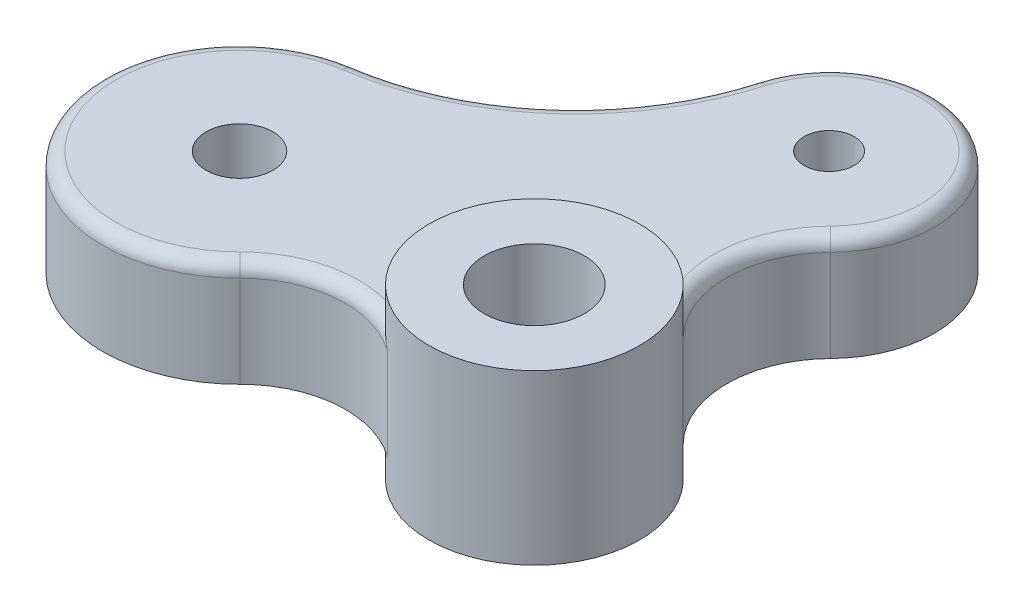
ISO-10303-21;
HEADER;
FILE_DESCRIPTION(('STEP AP214'),'2;1');
FILE_NAME('part.step','',(''),(''),'','','');
FILE_SCHEMA(('AUTOMOTIVE_DESIGN { 1 0 10303 214 1 1 1 1 }'));
ENDSEC;
DATA;
#1=APPLICATION_CONTEXT('core data for automotive mechanical design processes');
#2=APPLICATION_PROTOCOL_DEFINITION('international standard','automotive_design',2000,#1);
#3=PRODUCT_CONTEXT('',#1,'mechanical');
#4=PRODUCT('Part','Part','',(#3));
#5=PRODUCT_RELATED_PRODUCT_CATEGORY('part','',(#4));
#6=PRODUCT_DEFINITION_FORMATION('','',#4);
#7=PRODUCT_DEFINITION_CONTEXT('part definition',#1,'design');
#8=PRODUCT_DEFINITION('design','',#6,#7);
#9=PRODUCT_DEFINITION_SHAPE('','',#8);
#10=(LENGTH_UNIT() NAMED_UNIT(*) SI_UNIT(.MILLI.,.METRE.));
#11=(NAMED_UNIT(*) PLANE_ANGLE_UNIT() SI_UNIT($,.RADIAN.));
#12=(NAMED_UNIT(*) SI_UNIT($,.STERADIAN.) SOLID_ANGLE_UNIT());
#13=UNCERTAINTY_MEASURE_WITH_UNIT(LENGTH_MEASURE(1.E-05),#10,'distance_accuracy_value','');
#14=(GEOMETRIC_REPRESENTATION_CONTEXT(3) GLOBAL_UNCERTAINTY_ASSIGNED_CONTEXT((#13)) GLOBAL_UNIT_ASSIGNED_CONTEXT((#10,
#11,#12)) REPRESENTATION_CONTEXT('',''));
#15=CARTESIAN_POINT('',(0.,0.,0.));
#16=DIRECTION('',(0.,0.,1.));
#17=DIRECTION('',(1.,0.,0.));
#18=AXIS2_PLACEMENT_3D('',#15,#16,#17);
#19=CARTESIAN_POINT('',(0.,20.0025,0.));
#20=DIRECTION('',(0.,-1.,0.));
#21=DIRECTION('',(0.,0.,-1.));
#22=AXIS2_PLACEMENT_3D('',#19,#20,#21);
#23=CYLINDRICAL_SURFACE('',#22,11.9126);
#24=CARTESIAN_POINT('',(0.,20.0025,0.));
#25=DIRECTION('',(0.,1.,0.));
#26=DIRECTION('',(0.,0.,1.));
#27=AXIS2_PLACEMENT_3D('',#24,#25,#26);
#28=CIRCLE('',#27,11.9126);
#29=CARTESIAN_POINT('',(0.,20.0025,11.9126));
#30=VERTEX_POINT('',#29);
#31=EDGE_CURVE('E163',#30,#30,#28,.T.);
#32=ORIENTED_EDGE('',*,*,#31,.T.);
#33=EDGE_LOOP('',(#32));
#34=FACE_BOUND('',#33,.T.);
#35=CARTESIAN_POINT('',(0.,-20.0025,0.));
#36=DIRECTION('',(0.,1.,0.));
#37=DIRECTION('',(0.,0.,1.));
#38=AXIS2_PLACEMENT_3D('',#35,#36,#37);
#39=CIRCLE('',#38,11.9126);
#40=CARTESIAN_POINT('',(0.,-20.0025,11.9126));
#41=VERTEX_POINT('',#40);
#42=EDGE_CURVE('E119',#41,#41,#39,.T.);
#43=ORIENTED_EDGE('',*,*,#42,.F.);
#44=EDGE_LOOP('',(#43));
#45=FACE_BOUND('',#44,.T.);
#46=ADVANCED_FACE('F36',(#34,#45),#23,.F.);
#47=CARTESIAN_POINT('',(0.,20.0025,0.));
#48=DIRECTION('',(0.,-1.,0.));
#49=DIRECTION('',(0.,0.,-1.));
#50=AXIS2_PLACEMENT_3D('',#47,#48,#49);
#51=CYLINDRICAL_SURFACE('',#50,25.0063);
#52=DIRECTION('',(0.,-1.,0.));
#53=VECTOR('',#52,1.);
#54=CARTESIAN_POINT('',(17.8574475665249,12.4968,-17.5050451612903));
#55=LINE('',#54,#53);
#56=CARTESIAN_POINT('',(17.8574475665249,9.3218,-17.5050451612903));
#57=VERTEX_POINT('',#56);
#58=CARTESIAN_POINT('',(17.8574475665249,-12.4968,-17.5050451612903));
#59=VERTEX_POINT('',#58);
#60=EDGE_CURVE('E158',#57,#59,#55,.T.);
#61=ORIENTED_EDGE('',*,*,#60,.F.);
#62=CARTESIAN_POINT('',(10.3298286871432,12.4968,-22.7730032930282));
#63=CARTESIAN_POINT('',(10.4419521679474,12.4967936063939,-22.7221457394702));
#64=CARTESIAN_POINT('',(10.5536677196258,12.4938576603024,-22.6704713689525));
#65=CARTESIAN_POINT('',(10.7760634413224,12.4826061915554,-22.5656063497802));
#66=CARTESIAN_POINT('',(10.8867439906959,12.4742927251279,-22.5124162881159));
#67=CARTESIAN_POINT('',(11.2165241588368,12.4420508239024,-22.3509379701811));
#68=CARTESIAN_POINT('',(11.4338811455366,12.4108163941936,-22.2405060578209));
#69=CARTESIAN_POINT('',(11.8607859073873,12.332511862743,-22.0157776795195));
#70=CARTESIAN_POINT('',(12.0703892773512,12.2855996702782,-21.9015295894547));
#71=CARTESIAN_POINT('',(12.4837890668611,12.1784847584295,-21.668557450034));
#72=CARTESIAN_POINT('',(12.6875813366588,12.1182727973049,-21.5498303360996));
#73=CARTESIAN_POINT('',(13.0918595501829,11.9859041131738,-21.3066813875742));
#74=CARTESIAN_POINT('',(13.2922610073572,11.9135939627503,-21.182203562955));
#75=CARTESIAN_POINT('',(13.6869341438385,11.7595712424757,-20.9293529003005));
#76=CARTESIAN_POINT('',(13.8812044923465,11.6778566489696,-20.800979228346));
#77=CARTESIAN_POINT('',(14.263859788499,11.5066541435696,-20.5404711019414));
#78=CARTESIAN_POINT('',(14.4522414469327,11.4171619892916,-20.4083346217673));
#79=CARTESIAN_POINT('',(14.8232654961716,11.2318613357841,-20.1404613157331));
#80=CARTESIAN_POINT('',(15.0059071809191,11.1360520639599,-20.0047240507082));
#81=CARTESIAN_POINT('',(15.5473940019948,10.8400906926131,-19.5908362753573));
#82=CARTESIAN_POINT('',(15.8979370015286,10.6322664771331,-19.3072830951359));
#83=CARTESIAN_POINT('',(16.5789183048313,10.2049779479479,-18.7257818378262));
#84=CARTESIAN_POINT('',(16.9093661651873,9.98551926164557,-18.4278407260468));
#85=CARTESIAN_POINT('',(17.3348184980489,9.6921225200954,-18.0233082789914));
#86=CARTESIAN_POINT('',(17.4378603828178,9.62018255343795,-17.9236320780338));
#87=CARTESIAN_POINT('',(17.6420485271755,9.47611734834702,-17.7226882035823));
#88=CARTESIAN_POINT('',(17.7431962679432,9.40399230951588,-17.6214218981062));
#89=CARTESIAN_POINT('',(17.8481269093726,9.32850905790795,-17.5145496591785));
#90=CARTESIAN_POINT('',(17.8527881887275,9.32515452699892,-17.5097983375322));
#91=CARTESIAN_POINT('',(17.8574475665249,9.3218,-17.5050451612903));
#92=B_SPLINE_CURVE_WITH_KNOTS('',3,(#62,#63,#64,#65,#66,#67,#68,#69,#70,#71,#72,#73,#74,#75,#76,
#77,#78,#79,#80,#81,#82,#83,#84,#85,#86,#87,#88,#89,#90,#91),.UNSPECIFIED.,.F.,.F.,(4,2,2,2,2,2,
2,2,2,2,2,2,2,2,4),(0.,0.369262063996806,0.738383014913317,1.47492149695537,2.2042544435751,
2.93409579226768,3.67401295963575,4.41408964165639,5.15457257389372,5.89514623712289,
7.38352573589504,8.87119178389183,9.3523826424057,9.83318002456653,9.85554068268082),.UNSPECIFIED.);
#93=CARTESIAN_POINT('',(10.3298286871432,12.4968,-22.7730032930282));
#94=VERTEX_POINT('',#93);
#95=EDGE_CURVE('E46',#57,#94,#92,.F.);
#96=ORIENTED_EDGE('',*,*,#95,.T.);
#97=CARTESIAN_POINT('',(0.,12.4968,0.));
#98=DIRECTION('',(0.,1.,0.));
#99=DIRECTION('',(0.,0.,1.));
#100=AXIS2_PLACEMENT_3D('',#97,#98,#99);
#101=CIRCLE('',#100,25.0063);
#102=CARTESIAN_POINT('',(-20.9655076747199,12.4968,13.6294727569067));
#103=VERTEX_POINT('',#102);
#104=EDGE_CURVE('E269',#94,#103,#101,.T.);
#105=ORIENTED_EDGE('',*,*,#104,.T.);
#106=CARTESIAN_POINT('',(-20.9655076747199,12.4968,13.6294727569067));
#107=CARTESIAN_POINT('',(-20.8984042183351,12.4967936063939,13.7326972299872));
#108=CARTESIAN_POINT('',(-20.8305543900075,12.4938576603024,13.8353958465852));
#109=CARTESIAN_POINT('',(-20.6935109513742,12.4826061915555,14.0395419344793));
#110=CARTESIAN_POINT('',(-20.6243178645018,12.4742927251279,14.1409898689014));
#111=CARTESIAN_POINT('',(-20.4151913495656,12.4420508239025,14.4428115169199));
#112=CARTESIAN_POINT('',(-20.2733999686794,12.4108163941937,14.641140716084));
#113=CARTESIAN_POINT('',(-19.9871679824365,12.3325118627431,15.0294985018386));
#114=CARTESIAN_POINT('',(-19.8427668647318,12.2855996702783,15.2195893116884));
#115=CARTESIAN_POINT('',(-19.5504105265156,12.1784847584296,15.5933581911021));
#116=CARTESIAN_POINT('',(-19.4024528986838,12.118272797305,15.7770316981164));
#117=CARTESIAN_POINT('',(-19.1014034125352,11.9859041131738,16.1402554473249));
#118=CARTESIAN_POINT('',(-18.9482688731232,11.9135939627503,16.3197137591932));
#119=CARTESIAN_POINT('',(-18.6390684949176,11.7595712424756,16.6719856263391));
#120=CARTESIAN_POINT('',(-18.4830020312986,11.6778566489695,16.8447977407696));
#121=CARTESIAN_POINT('',(-18.1680338533021,11.5066541435695,17.1840389623894));
#122=CARTESIAN_POINT('',(-18.0091306295974,11.4171619892914,17.3504645136827));
#123=CARTESIAN_POINT('',(-17.6886256285269,11.2318613357839,17.6771011581185));
#124=CARTESIAN_POINT('',(-17.5270235228944,11.1360520639597,17.8373114873079));
#125=CARTESIAN_POINT('',(-17.0365826913896,10.840090692613,18.3105755349351));
#126=CARTESIAN_POINT('',(-16.7036479851339,10.6322664771332,18.6146105360554));
#127=CARTESIAN_POINT('',(-16.0265628381989,10.2049779479475,19.2006437701811));
#128=CARTESIAN_POINT('',(-15.682417850252,9.98551926164443,19.4826524965937));
#129=CARTESIAN_POINT('',(-15.2186347294205,9.6921225200957,19.8425988885613));
#130=CARTESIAN_POINT('',(-15.1046276389344,9.6201825534388,19.9295204530493));
#131=CARTESIAN_POINT('',(-14.8753243920995,9.47611734834609,20.1012506483158));
#132=CARTESIAN_POINT('',(-14.7600293660691,9.40399230951263,20.1860609487486));
#133=CARTESIAN_POINT('',(-14.638624318867,9.32850905790765,20.2737702953343));
#134=CARTESIAN_POINT('',(-14.6332274567457,9.32515452699876,20.2776659931994));
#135=CARTESIAN_POINT('',(-14.6278290463037,9.3218,20.2815595327902));
#136=B_SPLINE_CURVE_WITH_KNOTS('',3,(#106,#107,#108,#109,#110,#111,#112,#113,#114,#115,#116,
#117,#118,#119,#120,#121,#122,#123,#124,#125,#126,#127,#128,#129,#130,#131,#132,#133,#134,#135),
.UNSPECIFIED.,.F.,.F.,(4,2,2,2,2,2,2,2,2,2,2,2,2,2,4),(0.,0.369262063996613,0.738383014912932,
1.47492149695457,2.2042544435747,2.9340957922677,3.67401295963593,4.41408964165673,
5.15457257389419,5.89514623712349,7.38352573589537,8.87119178389193,9.35238264240576,
9.83318002456654,9.85554068268083),.UNSPECIFIED.);
#137=CARTESIAN_POINT('',(-14.6278290463037,9.3218,20.2815595327902));
#138=VERTEX_POINT('',#137);
#139=EDGE_CURVE('E11',#103,#138,#136,.T.);
#140=ORIENTED_EDGE('',*,*,#139,.T.);
#141=DIRECTION('',(0.,-1.,0.));
#142=VECTOR('',#141,1.);
#143=CARTESIAN_POINT('',(-14.6278290463037,12.4968,20.2815595327902));
#144=LINE('',#143,#142);
#145=CARTESIAN_POINT('',(-14.6278290463037,-12.4968,20.2815595327902));
#146=VERTEX_POINT('',#145);
#147=EDGE_CURVE('E160',#138,#146,#144,.T.);
#148=ORIENTED_EDGE('',*,*,#147,.T.);
#149=CARTESIAN_POINT('',(0.,-12.4968,0.));
#150=DIRECTION('',(0.,1.,0.));
#151=DIRECTION('',(0.,0.,1.));
#152=AXIS2_PLACEMENT_3D('',#149,#150,#151);
#153=CIRCLE('',#152,25.0063);
#154=EDGE_CURVE('E143',#59,#146,#153,.T.);
#155=ORIENTED_EDGE('',*,*,#154,.F.);
#156=EDGE_LOOP('',(#61,#96,#105,#140,#148,#155));
#157=FACE_BOUND('',#156,.T.);
#158=CARTESIAN_POINT('',(0.,20.0025,0.));
#159=DIRECTION('',(0.,1.,0.));
#160=DIRECTION('',(0.,0.,1.));
#161=AXIS2_PLACEMENT_3D('',#158,#159,#160);
#162=CIRCLE('',#161,25.0063);
#163=CARTESIAN_POINT('',(0.,20.0025,25.0063));
#164=VERTEX_POINT('',#163);
#165=EDGE_CURVE('E166',#164,#164,#162,.T.);
#166=ORIENTED_EDGE('',*,*,#165,.F.);
#167=EDGE_LOOP('',(#166));
#168=FACE_BOUND('',#167,.T.);
#169=CARTESIAN_POINT('',(0.,-20.0025,0.));
#170=DIRECTION('',(0.,1.,0.));
#171=DIRECTION('',(0.,0.,1.));
#172=AXIS2_PLACEMENT_3D('',#169,#170,#171);
#173=CIRCLE('',#172,25.0063);
#174=CARTESIAN_POINT('',(0.,-20.0025,25.0063));
#175=VERTEX_POINT('',#174);
#176=EDGE_CURVE('E167',#175,#175,#173,.T.);
#177=ORIENTED_EDGE('',*,*,#176,.T.);
#178=EDGE_LOOP('',(#177));
#179=FACE_BOUND('',#178,.T.);
#180=ADVANCED_FACE('F208',(#157,#168,#179),#51,.T.);
#181=CARTESIAN_POINT('',(0.,20.0025,0.));
#182=DIRECTION('',(0.,1.,0.));
#183=DIRECTION('',(0.,0.,1.));
#184=AXIS2_PLACEMENT_3D('',#181,#182,#183);
#185=PLANE('',#184);
#186=ORIENTED_EDGE('',*,*,#31,.F.);
#187=EDGE_LOOP('',(#186));
#188=FACE_BOUND('',#187,.T.);
#189=ORIENTED_EDGE('',*,*,#165,.T.);
#190=EDGE_LOOP('',(#189));
#191=FACE_BOUND('',#190,.T.);
#192=ADVANCED_FACE('F212',(#188,#191),#185,.T.);
#193=CARTESIAN_POINT('',(0.,-20.0025,0.));
#194=DIRECTION('',(0.,1.,0.));
#195=DIRECTION('',(0.,0.,1.));
#196=AXIS2_PLACEMENT_3D('',#193,#194,#195);
#197=PLANE('',#196);
#198=ORIENTED_EDGE('',*,*,#42,.T.);
#199=EDGE_LOOP('',(#198));
#200=FACE_BOUND('',#199,.T.);
#201=ORIENTED_EDGE('',*,*,#176,.F.);
#202=EDGE_LOOP('',(#201));
#203=FACE_BOUND('',#202,.T.);
#204=ADVANCED_FACE('F213',(#200,#203),#197,.F.);
#205=CARTESIAN_POINT('',(-84.1767783603862,12.4968,-93.9454100730132));
#206=DIRECTION('',(0.,-1.,0.));
#207=DIRECTION('',(0.,0.,-1.));
#208=AXIS2_PLACEMENT_3D('',#205,#206,#207);
#209=CYLINDRICAL_SURFACE('',#208,62.5094);
#210=DIRECTION('',(0.,-1.,0.));
#211=VECTOR('',#210,1.);
#212=CARTESIAN_POINT('',(-74.8509809683503,12.4968,-32.1355840632056));
#213=LINE('',#212,#211);
#214=CARTESIAN_POINT('',(-74.8509809683503,9.3218,-32.1355840632056));
#215=VERTEX_POINT('',#214);
#216=CARTESIAN_POINT('',(-74.8509809683503,-12.4968,-32.1355840632056));
#217=VERTEX_POINT('',#216);
#218=EDGE_CURVE('E109',#215,#217,#213,.T.);
#219=ORIENTED_EDGE('',*,*,#218,.F.);
#220=CARTESIAN_POINT('',(-84.1767783603862,9.3218,-93.9454100730132));
#221=DIRECTION('',(0.,1.,0.));
#222=DIRECTION('',(0.,0.,1.));
#223=AXIS2_PLACEMENT_3D('',#220,#221,#222);
#224=CIRCLE('',#223,62.5094);
#225=CARTESIAN_POINT('',(-24.0522531695836,9.3218,-76.8437563827838));
#226=VERTEX_POINT('',#225);
#227=EDGE_CURVE('E189',#215,#226,#224,.T.);
#228=ORIENTED_EDGE('',*,*,#227,.T.);
#229=DIRECTION('',(0.,-1.,0.));
#230=VECTOR('',#229,1.);
#231=CARTESIAN_POINT('',(-24.0522531695836,12.4968,-76.8437563827838));
#232=LINE('',#231,#230);
#233=CARTESIAN_POINT('',(-24.0522531695836,-12.4968,-76.8437563827838));
#234=VERTEX_POINT('',#233);
#235=EDGE_CURVE('E134',#226,#234,#232,.T.);
#236=ORIENTED_EDGE('',*,*,#235,.T.);
#237=CARTESIAN_POINT('',(-84.1767783603862,-12.4968,-93.9454100730132));
#238=DIRECTION('',(0.,1.,0.));
#239=DIRECTION('',(0.,0.,1.));
#240=AXIS2_PLACEMENT_3D('',#237,#238,#239);
#241=CIRCLE('',#240,62.5094);
#242=EDGE_CURVE('E127',#217,#234,#241,.T.);
#243=ORIENTED_EDGE('',*,*,#242,.F.);
#244=EDGE_LOOP('',(#219,#228,#236,#243));
#245=FACE_BOUND('',#244,.T.);
#246=ADVANCED_FACE('F132',(#245),#209,.F.);
#247=CARTESIAN_POINT('',(-70.0024,12.4968,0.));
#248=DIRECTION('',(0.,-1.,0.));
#249=DIRECTION('',(0.,0.,-1.));
#250=AXIS2_PLACEMENT_3D('',#247,#248,#249);
#251=CYLINDRICAL_SURFACE('',#250,32.4993);
#252=DIRECTION('',(0.,-1.,0.));
#253=VECTOR('',#252,1.);
#254=CARTESIAN_POINT('',(-46.9650853283781,12.4968,22.9234952223842));
#255=LINE('',#254,#253);
#256=CARTESIAN_POINT('',(-46.9650853283781,9.3218,22.9234952223842));
#257=VERTEX_POINT('',#256);
#258=CARTESIAN_POINT('',(-46.9650853283781,-12.4968,22.9234952223842));
#259=VERTEX_POINT('',#258);
#260=EDGE_CURVE('E120',#257,#259,#255,.T.);
#261=ORIENTED_EDGE('',*,*,#260,.F.);
#262=CARTESIAN_POINT('',(-70.0024,9.3218,0.));
#263=DIRECTION('',(0.,1.,0.));
#264=DIRECTION('',(0.,0.,1.));
#265=AXIS2_PLACEMENT_3D('',#262,#263,#264);
#266=CIRCLE('',#265,32.4993);
#267=EDGE_CURVE('E115',#257,#215,#266,.F.);
#268=ORIENTED_EDGE('',*,*,#267,.T.);
#269=ORIENTED_EDGE('',*,*,#218,.T.);
#270=CARTESIAN_POINT('',(-70.0024,-12.4968,0.));
#271=DIRECTION('',(0.,1.,0.));
#272=DIRECTION('',(0.,0.,1.));
#273=AXIS2_PLACEMENT_3D('',#270,#271,#272);
#274=CIRCLE('',#273,32.4993);
#275=EDGE_CURVE('E112',#217,#259,#274,.T.);
#276=ORIENTED_EDGE('',*,*,#275,.T.);
#277=EDGE_LOOP('',(#261,#268,#269,#276));
#278=FACE_BOUND('',#277,.T.);
#279=ADVANCED_FACE('F111',(#278),#251,.T.);
#280=CARTESIAN_POINT('',(-29.2482290275762,12.4968,40.5528186290478));
#281=DIRECTION('',(0.,-1.,0.));
#282=DIRECTION('',(0.,0.,-1.));
#283=AXIS2_PLACEMENT_3D('',#280,#281,#282);
#284=CYLINDRICAL_SURFACE('',#283,24.9936);
#285=ORIENTED_EDGE('',*,*,#147,.F.);
#286=CARTESIAN_POINT('',(-29.2482290275762,9.3218,40.5528186290478));
#287=DIRECTION('',(0.,1.,0.));
#288=DIRECTION('',(0.,0.,1.));
#289=AXIS2_PLACEMENT_3D('',#286,#287,#288);
#290=CIRCLE('',#289,24.9936);
#291=EDGE_CURVE('E54',#138,#257,#290,.T.);
#292=ORIENTED_EDGE('',*,*,#291,.T.);
#293=ORIENTED_EDGE('',*,*,#260,.T.);
#294=CARTESIAN_POINT('',(-29.2482290275762,-12.4968,40.5528186290478));
#295=DIRECTION('',(0.,1.,0.));
#296=DIRECTION('',(0.,0.,1.));
#297=AXIS2_PLACEMENT_3D('',#294,#295,#296);
#298=CIRCLE('',#297,24.9936);
#299=EDGE_CURVE('E130',#146,#259,#298,.T.);
#300=ORIENTED_EDGE('',*,*,#299,.F.);
#301=EDGE_LOOP('',(#285,#292,#293,#300));
#302=FACE_BOUND('',#301,.T.);
#303=ADVANCED_FACE('F246',(#302),#284,.F.);
#304=CARTESIAN_POINT('',(35.7058258351491,12.4968,-35.0012));
#305=DIRECTION('',(0.,-1.,0.));
#306=DIRECTION('',(0.,0.,-1.));
#307=AXIS2_PLACEMENT_3D('',#304,#305,#306);
#308=CYLINDRICAL_SURFACE('',#307,24.9936);
#309=DIRECTION('',(0.,-1.,0.));
#310=VECTOR('',#309,1.);
#311=CARTESIAN_POINT('',(17.8574475665249,12.4968,-52.4973548387097));
#312=LINE('',#311,#310);
#313=CARTESIAN_POINT('',(17.8574475665249,9.3218,-52.4973548387097));
#314=VERTEX_POINT('',#313);
#315=CARTESIAN_POINT('',(17.8574475665249,-12.4968,-52.4973548387097));
#316=VERTEX_POINT('',#315);
#317=EDGE_CURVE('E155',#314,#316,#312,.T.);
#318=ORIENTED_EDGE('',*,*,#317,.F.);
#319=CARTESIAN_POINT('',(35.7058258351491,9.3218,-35.0012));
#320=DIRECTION('',(0.,1.,0.));
#321=DIRECTION('',(0.,0.,1.));
#322=AXIS2_PLACEMENT_3D('',#319,#320,#321);
#323=CIRCLE('',#322,24.9936);
#324=EDGE_CURVE('E170',#314,#57,#323,.T.);
#325=ORIENTED_EDGE('',*,*,#324,.T.);
#326=ORIENTED_EDGE('',*,*,#60,.T.);
#327=CARTESIAN_POINT('',(35.7058258351491,-12.4968,-35.0012));
#328=DIRECTION('',(0.,1.,0.));
#329=DIRECTION('',(0.,0.,1.));
#330=AXIS2_PLACEMENT_3D('',#327,#328,#329);
#331=CIRCLE('',#330,24.9936);
#332=EDGE_CURVE('E145',#316,#59,#331,.T.);
#333=ORIENTED_EDGE('',*,*,#332,.F.);
#334=EDGE_LOOP('',(#318,#325,#326,#333));
#335=FACE_BOUND('',#334,.T.);
#336=ADVANCED_FACE('F249',(#335),#308,.F.);
#337=CARTESIAN_POINT('',(0.,12.4968,-70.0024));
#338=DIRECTION('',(0.,-1.,0.));
#339=DIRECTION('',(0.,0.,-1.));
#340=AXIS2_PLACEMENT_3D('',#337,#338,#339);
#341=CYLINDRICAL_SURFACE('',#340,25.0063);
#342=ORIENTED_EDGE('',*,*,#235,.F.);
#343=CARTESIAN_POINT('',(0.,9.3218,-70.0024));
#344=DIRECTION('',(0.,1.,0.));
#345=DIRECTION('',(0.,0.,1.));
#346=AXIS2_PLACEMENT_3D('',#343,#344,#345);
#347=CIRCLE('',#346,25.0063);
#348=EDGE_CURVE('E187',#226,#314,#347,.F.);
#349=ORIENTED_EDGE('',*,*,#348,.T.);
#350=ORIENTED_EDGE('',*,*,#317,.T.);
#351=CARTESIAN_POINT('',(0.,-12.4968,-70.0024));
#352=DIRECTION('',(0.,1.,0.));
#353=DIRECTION('',(0.,0.,1.));
#354=AXIS2_PLACEMENT_3D('',#351,#352,#353);
#355=CIRCLE('',#354,25.0063);
#356=EDGE_CURVE('E148',#316,#234,#355,.T.);
#357=ORIENTED_EDGE('',*,*,#356,.T.);
#358=EDGE_LOOP('',(#342,#349,#350,#357));
#359=FACE_BOUND('',#358,.T.);
#360=ADVANCED_FACE('F241',(#359),#341,.T.);
#361=CARTESIAN_POINT('',(0.,12.4968,-70.0024));
#362=DIRECTION('',(0.,-1.,0.));
#363=DIRECTION('',(0.,0.,-1.));
#364=AXIS2_PLACEMENT_3D('',#361,#362,#363);
#365=CYLINDRICAL_SURFACE('',#364,5.9563);
#366=CARTESIAN_POINT('',(0.,12.4968,-70.0024));
#367=DIRECTION('',(0.,1.,0.));
#368=DIRECTION('',(0.,0.,1.));
#369=AXIS2_PLACEMENT_3D('',#366,#367,#368);
#370=CIRCLE('',#369,5.9563);
#371=CARTESIAN_POINT('',(0.,12.4968,-64.0461));
#372=VERTEX_POINT('',#371);
#373=EDGE_CURVE('E153',#372,#372,#370,.T.);
#374=ORIENTED_EDGE('',*,*,#373,.T.);
#375=EDGE_LOOP('',(#374));
#376=FACE_BOUND('',#375,.T.);
#377=CARTESIAN_POINT('',(0.,-12.4968,-70.0024));
#378=DIRECTION('',(0.,1.,0.));
#379=DIRECTION('',(0.,0.,1.));
#380=AXIS2_PLACEMENT_3D('',#377,#378,#379);
#381=CIRCLE('',#380,5.9563);
#382=CARTESIAN_POINT('',(0.,-12.4968,-64.0461));
#383=VERTEX_POINT('',#382);
#384=EDGE_CURVE('E136',#383,#383,#381,.T.);
#385=ORIENTED_EDGE('',*,*,#384,.F.);
#386=EDGE_LOOP('',(#385));
#387=FACE_BOUND('',#386,.T.);
#388=ADVANCED_FACE('F238',(#376,#387),#365,.F.);
#389=CARTESIAN_POINT('',(-70.0024,12.4968,0.));
#390=DIRECTION('',(0.,-1.,0.));
#391=DIRECTION('',(0.,0.,-1.));
#392=AXIS2_PLACEMENT_3D('',#389,#390,#391);
#393=CYLINDRICAL_SURFACE('',#392,7.93749999999999);
#394=CARTESIAN_POINT('',(-70.0024,12.4968,0.));
#395=DIRECTION('',(0.,1.,0.));
#396=DIRECTION('',(0.,0.,1.));
#397=AXIS2_PLACEMENT_3D('',#394,#395,#396);
#398=CIRCLE('',#397,7.93749999999999);
#399=CARTESIAN_POINT('',(-70.0024,12.4968,7.93749999999999));
#400=VERTEX_POINT('',#399);
#401=EDGE_CURVE('E156',#400,#400,#398,.T.);
#402=ORIENTED_EDGE('',*,*,#401,.T.);
#403=EDGE_LOOP('',(#402));
#404=FACE_BOUND('',#403,.T.);
#405=CARTESIAN_POINT('',(-70.0024,-12.4968,0.));
#406=DIRECTION('',(0.,1.,0.));
#407=DIRECTION('',(0.,0.,1.));
#408=AXIS2_PLACEMENT_3D('',#405,#406,#407);
#409=CIRCLE('',#408,7.93749999999999);
#410=CARTESIAN_POINT('',(-70.0024,-12.4968,7.93749999999999));
#411=VERTEX_POINT('',#410);
#412=EDGE_CURVE('E150',#411,#411,#409,.T.);
#413=ORIENTED_EDGE('',*,*,#412,.F.);
#414=EDGE_LOOP('',(#413));
#415=FACE_BOUND('',#414,.T.);
#416=ADVANCED_FACE('F240',(#404,#415),#393,.F.);
#417=CARTESIAN_POINT('',(0.,12.4968,0.));
#418=DIRECTION('',(0.,1.,0.));
#419=DIRECTION('',(0.,0.,1.));
#420=AXIS2_PLACEMENT_3D('',#417,#418,#419);
#421=PLANE('',#420);
#422=ORIENTED_EDGE('',*,*,#104,.F.);
#423=CARTESIAN_POINT('',(35.7058258351491,12.4968,-35.0012));
#424=DIRECTION('',(0.,1.,0.));
#425=DIRECTION('',(0.,0.,1.));
#426=AXIS2_PLACEMENT_3D('',#423,#424,#425);
#427=CIRCLE('',#426,28.1686);
#428=CARTESIAN_POINT('',(15.590123091344,12.4968,-54.719935483871));
#429=VERTEX_POINT('',#428);
#430=EDGE_CURVE('E185',#94,#429,#427,.F.);
#431=ORIENTED_EDGE('',*,*,#430,.T.);
#432=CARTESIAN_POINT('',(0.,12.4968,-70.0024));
#433=DIRECTION('',(0.,1.,0.));
#434=DIRECTION('',(0.,0.,1.));
#435=AXIS2_PLACEMENT_3D('',#432,#433,#434);
#436=CIRCLE('',#435,21.8313);
#437=CARTESIAN_POINT('',(-20.9983865914242,12.4968,-75.9751230177782));
#438=VERTEX_POINT('',#437);
#439=EDGE_CURVE('E183',#429,#438,#436,.T.);
#440=ORIENTED_EDGE('',*,*,#439,.T.);
#441=CARTESIAN_POINT('',(-84.1767783603862,12.4968,-93.9454100730132));
#442=DIRECTION('',(0.,1.,0.));
#443=DIRECTION('',(0.,0.,1.));
#444=AXIS2_PLACEMENT_3D('',#441,#442,#443);
#445=CIRCLE('',#444,65.6844);
#446=CARTESIAN_POINT('',(-74.3773017021965,12.4968,-28.9961170777419));
#447=VERTEX_POINT('',#446);
#448=EDGE_CURVE('E181',#438,#447,#445,.F.);
#449=ORIENTED_EDGE('',*,*,#448,.T.);
#450=CARTESIAN_POINT('',(-70.0024,12.4968,0.));
#451=DIRECTION('',(0.,1.,0.));
#452=DIRECTION('',(0.,0.,1.));
#453=AXIS2_PLACEMENT_3D('',#450,#451,#452);
#454=CIRCLE('',#453,29.3243);
#455=CARTESIAN_POINT('',(-49.2157022365084,12.4968,20.6839978384077));
#456=VERTEX_POINT('',#455);
#457=EDGE_CURVE('E177',#447,#456,#454,.T.);
#458=ORIENTED_EDGE('',*,*,#457,.T.);
#459=CARTESIAN_POINT('',(-29.2482290275762,12.4968,40.5528186290478));
#460=DIRECTION('',(0.,1.,0.));
#461=DIRECTION('',(0.,0.,1.));
#462=AXIS2_PLACEMENT_3D('',#459,#460,#461);
#463=CIRCLE('',#462,28.1686);
#464=EDGE_CURVE('E179',#456,#103,#463,.F.);
#465=ORIENTED_EDGE('',*,*,#464,.T.);
#466=EDGE_LOOP('',(#422,#431,#440,#449,#458,#465));
#467=FACE_BOUND('',#466,.T.);
#468=ORIENTED_EDGE('',*,*,#373,.F.);
#469=EDGE_LOOP('',(#468));
#470=FACE_BOUND('',#469,.T.);
#471=ORIENTED_EDGE('',*,*,#401,.F.);
#472=EDGE_LOOP('',(#471));
#473=FACE_BOUND('',#472,.T.);
#474=ADVANCED_FACE('F258',(#467,#470,#473),#421,.T.);
#475=CARTESIAN_POINT('',(0.,-12.4968,0.));
#476=DIRECTION('',(0.,1.,0.));
#477=DIRECTION('',(0.,0.,1.));
#478=AXIS2_PLACEMENT_3D('',#475,#476,#477);
#479=PLANE('',#478);
#480=ORIENTED_EDGE('',*,*,#384,.T.);
#481=EDGE_LOOP('',(#480));
#482=FACE_BOUND('',#481,.T.);
#483=ORIENTED_EDGE('',*,*,#242,.T.);
#484=ORIENTED_EDGE('',*,*,#356,.F.);
#485=ORIENTED_EDGE('',*,*,#332,.T.);
#486=ORIENTED_EDGE('',*,*,#154,.T.);
#487=ORIENTED_EDGE('',*,*,#299,.T.);
#488=ORIENTED_EDGE('',*,*,#275,.F.);
#489=EDGE_LOOP('',(#483,#484,#485,#486,#487,#488));
#490=FACE_BOUND('',#489,.T.);
#491=ORIENTED_EDGE('',*,*,#412,.T.);
#492=EDGE_LOOP('',(#491));
#493=FACE_BOUND('',#492,.T.);
#494=ADVANCED_FACE('F124',(#482,#490,#493),#479,.F.);
#495=CARTESIAN_POINT('',(-29.2482290275762,9.3218,40.5528186290478));
#496=DIRECTION('',(0.,1.,0.));
#497=DIRECTION('',(0.,0.,1.));
#498=AXIS2_PLACEMENT_3D('',#495,#496,#497);
#499=TOROIDAL_SURFACE('',#498,28.1686,3.175);
#500=ORIENTED_EDGE('',*,*,#139,.F.);
#501=ORIENTED_EDGE('',*,*,#464,.F.);
#502=CARTESIAN_POINT('',(-49.2157022365084,9.3218,20.6839978384077));
#503=DIRECTION('',(-0.705353506764276,0.,0.708855719096163));
#504=DIRECTION('',(0.708855719096163,0.,0.705353506764276));
#505=AXIS2_PLACEMENT_3D('',#502,#503,#504);
#506=CIRCLE('',#505,3.175);
#507=EDGE_CURVE('E41',#257,#456,#506,.T.);
#508=ORIENTED_EDGE('',*,*,#507,.F.);
#509=ORIENTED_EDGE('',*,*,#291,.F.);
#510=EDGE_LOOP('',(#500,#501,#508,#509));
#511=FACE_BOUND('',#510,.T.);
#512=ADVANCED_FACE('F38',(#511),#499,.T.);
#513=CARTESIAN_POINT('',(-70.0024,9.3218,0.));
#514=DIRECTION('',(0.,1.,0.));
#515=DIRECTION('',(0.,0.,1.));
#516=AXIS2_PLACEMENT_3D('',#513,#514,#515);
#517=TOROIDAL_SURFACE('',#516,29.3243,3.175);
#518=ORIENTED_EDGE('',*,*,#507,.T.);
#519=ORIENTED_EDGE('',*,*,#457,.F.);
#520=CARTESIAN_POINT('',(-74.3773017021965,9.3218,-28.9961170777419));
#521=DIRECTION('',(0.988808499358619,0.,-0.14919032004844));
#522=DIRECTION('',(-0.14919032004844,0.,-0.988808499358619));
#523=AXIS2_PLACEMENT_3D('',#520,#521,#522);
#524=CIRCLE('',#523,3.175);
#525=EDGE_CURVE('E288',#215,#447,#524,.T.);
#526=ORIENTED_EDGE('',*,*,#525,.F.);
#527=ORIENTED_EDGE('',*,*,#267,.F.);
#528=EDGE_LOOP('',(#518,#519,#526,#527));
#529=FACE_BOUND('',#528,.T.);
#530=ADVANCED_FACE('F289',(#529),#517,.T.);
#531=CARTESIAN_POINT('',(-84.1767783603862,9.3218,-93.9454100730132));
#532=DIRECTION('',(0.,1.,0.));
#533=DIRECTION('',(0.,0.,1.));
#534=AXIS2_PLACEMENT_3D('',#531,#532,#533);
#535=TOROIDAL_SURFACE('',#534,65.6844,3.175);
#536=ORIENTED_EDGE('',*,*,#525,.T.);
#537=ORIENTED_EDGE('',*,*,#448,.F.);
#538=CARTESIAN_POINT('',(-20.9983865914242,9.3218,-75.9751230177782));
#539=DIRECTION('',(0.273585311812775,0.,-0.961847741152573));
#540=DIRECTION('',(-0.961847741152573,0.,-0.273585311812775));
#541=AXIS2_PLACEMENT_3D('',#538,#539,#540);
#542=CIRCLE('',#541,3.175);
#543=EDGE_CURVE('E294',#226,#438,#542,.T.);
#544=ORIENTED_EDGE('',*,*,#543,.F.);
#545=ORIENTED_EDGE('',*,*,#227,.F.);
#546=EDGE_LOOP('',(#536,#537,#544,#545));
#547=FACE_BOUND('',#546,.T.);
#548=ADVANCED_FACE('F296',(#547),#535,.T.);
#549=CARTESIAN_POINT('',(0.,9.3218,-70.0024));
#550=DIRECTION('',(0.,1.,0.));
#551=DIRECTION('',(0.,0.,1.));
#552=AXIS2_PLACEMENT_3D('',#549,#550,#551);
#553=TOROIDAL_SURFACE('',#552,21.8313,3.175);
#554=ORIENTED_EDGE('',*,*,#543,.T.);
#555=ORIENTED_EDGE('',*,*,#439,.F.);
#556=CARTESIAN_POINT('',(15.590123091344,9.3218,-54.719935483871));
#557=DIRECTION('',(-0.700025400050801,0.,0.714117944938871));
#558=DIRECTION('',(0.714117944938871,0.,0.700025400050801));
#559=AXIS2_PLACEMENT_3D('',#556,#557,#558);
#560=CIRCLE('',#559,3.175);
#561=EDGE_CURVE('E306',#314,#429,#560,.T.);
#562=ORIENTED_EDGE('',*,*,#561,.F.);
#563=ORIENTED_EDGE('',*,*,#348,.F.);
#564=EDGE_LOOP('',(#554,#555,#562,#563));
#565=FACE_BOUND('',#564,.T.);
#566=ADVANCED_FACE('F309',(#565),#553,.T.);
#567=CARTESIAN_POINT('',(35.7058258351491,9.3218,-35.0012));
#568=DIRECTION('',(0.,1.,0.));
#569=DIRECTION('',(0.,0.,1.));
#570=AXIS2_PLACEMENT_3D('',#567,#568,#569);
#571=TOROIDAL_SURFACE('',#570,28.1686,3.175);
#572=ORIENTED_EDGE('',*,*,#561,.T.);
#573=ORIENTED_EDGE('',*,*,#430,.F.);
#574=ORIENTED_EDGE('',*,*,#95,.F.);
#575=ORIENTED_EDGE('',*,*,#324,.F.);
#576=EDGE_LOOP('',(#572,#573,#574,#575));
#577=FACE_BOUND('',#576,.T.);
#578=ADVANCED_FACE('F204',(#577),#571,.T.);
#579=CLOSED_SHELL('',(#46,#180,#192,#204,#246,#279,#303,#336,#360,#388,#416,#474,#494,#512,#530,
#548,#566,#578));
#580=MANIFOLD_SOLID_BREP('B2',#579);
#581=ADVANCED_BREP_SHAPE_REPRESENTATION('',(#18,#580),#14);
#582=SHAPE_DEFINITION_REPRESENTATION(#9,#581);
ENDSEC;
END-ISO-10303-21;
